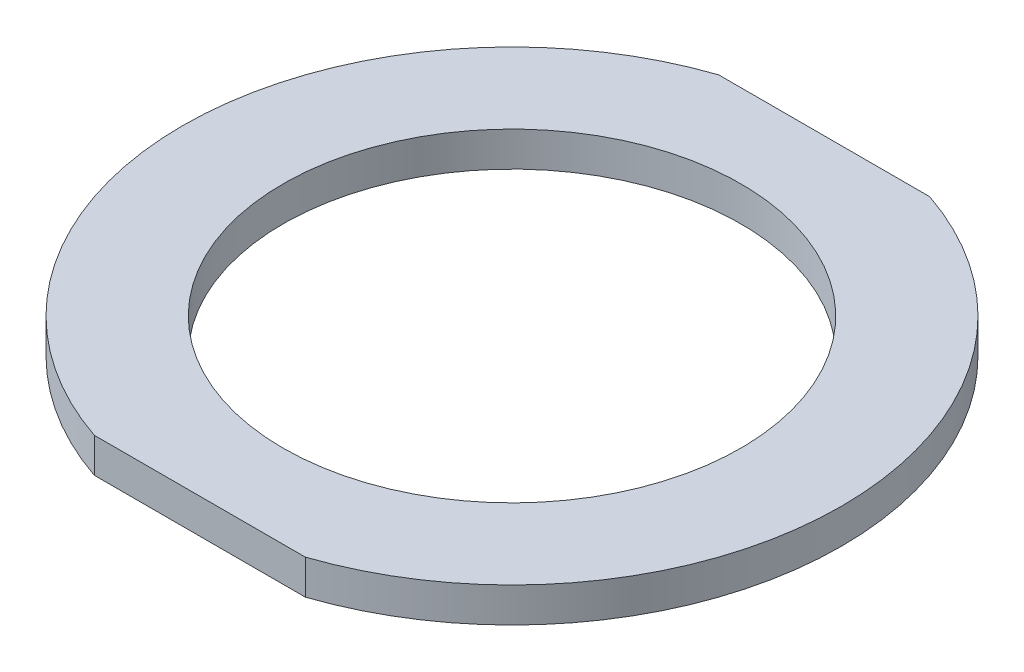
ISO-10303-21;
HEADER;
FILE_DESCRIPTION(('STEP AP214'),'2;1');
FILE_NAME('part.step','',(''),(''),'','','');
FILE_SCHEMA(('AUTOMOTIVE_DESIGN { 1 0 10303 214 1 1 1 1 }'));
ENDSEC;
DATA;
#1=APPLICATION_CONTEXT('core data for automotive mechanical design processes');
#2=APPLICATION_PROTOCOL_DEFINITION('international standard','automotive_design',2000,#1);
#3=PRODUCT_CONTEXT('',#1,'mechanical');
#4=PRODUCT('Part','Part','',(#3));
#5=PRODUCT_RELATED_PRODUCT_CATEGORY('part','',(#4));
#6=PRODUCT_DEFINITION_FORMATION('','',#4);
#7=PRODUCT_DEFINITION_CONTEXT('part definition',#1,'design');
#8=PRODUCT_DEFINITION('design','',#6,#7);
#9=PRODUCT_DEFINITION_SHAPE('','',#8);
#10=(LENGTH_UNIT() NAMED_UNIT(*) SI_UNIT(.MILLI.,.METRE.));
#11=(NAMED_UNIT(*) PLANE_ANGLE_UNIT() SI_UNIT($,.RADIAN.));
#12=(NAMED_UNIT(*) SI_UNIT($,.STERADIAN.) SOLID_ANGLE_UNIT());
#13=UNCERTAINTY_MEASURE_WITH_UNIT(LENGTH_MEASURE(1.E-05),#10,'distance_accuracy_value','');
#14=(GEOMETRIC_REPRESENTATION_CONTEXT(3) GLOBAL_UNCERTAINTY_ASSIGNED_CONTEXT((#13)) GLOBAL_UNIT_ASSIGNED_CONTEXT((#10,
#11,#12)) REPRESENTATION_CONTEXT('',''));
#15=CARTESIAN_POINT('',(0.,0.,0.));
#16=DIRECTION('',(0.,0.,1.));
#17=DIRECTION('',(1.,0.,0.));
#18=AXIS2_PLACEMENT_3D('',#15,#16,#17);
#19=CARTESIAN_POINT('',(0.,5.,0.));
#20=DIRECTION('',(0.,1.,0.));
#21=DIRECTION('',(0.,0.,1.));
#22=AXIS2_PLACEMENT_3D('',#19,#20,#21);
#23=PLANE('',#22);
#24=CARTESIAN_POINT('',(0.,5.,0.));
#25=DIRECTION('',(0.,1.,0.));
#26=DIRECTION('',(0.,0.,1.));
#27=AXIS2_PLACEMENT_3D('',#24,#25,#26);
#28=CIRCLE('',#27,33.);
#29=CARTESIAN_POINT('',(0.,5.,33.));
#30=VERTEX_POINT('',#29);
#31=EDGE_CURVE('E109',#30,#30,#28,.T.);
#32=ORIENTED_EDGE('',*,*,#31,.F.);
#33=EDGE_LOOP('',(#32));
#34=FACE_BOUND('',#33,.T.);
#35=CARTESIAN_POINT('',(0.,5.,0.));
#36=DIRECTION('',(0.,1.,0.));
#37=DIRECTION('',(0.,0.,1.));
#38=AXIS2_PLACEMENT_3D('',#35,#36,#37);
#39=CIRCLE('',#38,47.5);
#40=CARTESIAN_POINT('',(15.2069063257456,5.,45.));
#41=VERTEX_POINT('',#40);
#42=CARTESIAN_POINT('',(15.2069063257456,5.,-45.));
#43=VERTEX_POINT('',#42);
#44=EDGE_CURVE('E81',#41,#43,#39,.T.);
#45=ORIENTED_EDGE('',*,*,#44,.T.);
#46=DIRECTION('',(-1.,0.,0.));
#47=VECTOR('',#46,1.);
#48=CARTESIAN_POINT('',(0.,5.,-45.));
#49=LINE('',#48,#47);
#50=CARTESIAN_POINT('',(-15.2069063257456,5.,-45.));
#51=VERTEX_POINT('',#50);
#52=EDGE_CURVE('E74',#43,#51,#49,.T.);
#53=ORIENTED_EDGE('',*,*,#52,.T.);
#54=CARTESIAN_POINT('',(-15.2069063257456,5.,45.));
#55=VERTEX_POINT('',#54);
#56=EDGE_CURVE('E56',#51,#55,#39,.T.);
#57=ORIENTED_EDGE('',*,*,#56,.T.);
#58=DIRECTION('',(-1.,0.,0.));
#59=VECTOR('',#58,1.);
#60=CARTESIAN_POINT('',(0.,5.,45.));
#61=LINE('',#60,#59);
#62=EDGE_CURVE('E108',#41,#55,#61,.T.);
#63=ORIENTED_EDGE('',*,*,#62,.F.);
#64=EDGE_LOOP('',(#45,#53,#57,#63));
#65=FACE_BOUND('',#64,.T.);
#66=ADVANCED_FACE('F34',(#34,#65),#23,.T.);
#67=CARTESIAN_POINT('',(0.,0.,0.));
#68=DIRECTION('',(0.,1.,0.));
#69=DIRECTION('',(0.,0.,1.));
#70=AXIS2_PLACEMENT_3D('',#67,#68,#69);
#71=PLANE('',#70);
#72=CARTESIAN_POINT('',(0.,0.,0.));
#73=DIRECTION('',(0.,1.,0.));
#74=DIRECTION('',(0.,0.,1.));
#75=AXIS2_PLACEMENT_3D('',#72,#73,#74);
#76=CIRCLE('',#75,33.);
#77=CARTESIAN_POINT('',(0.,0.,33.));
#78=VERTEX_POINT('',#77);
#79=EDGE_CURVE('E94',#78,#78,#76,.T.);
#80=ORIENTED_EDGE('',*,*,#79,.T.);
#81=EDGE_LOOP('',(#80));
#82=FACE_BOUND('',#81,.T.);
#83=DIRECTION('',(-1.,0.,0.));
#84=VECTOR('',#83,1.);
#85=CARTESIAN_POINT('',(0.,0.,-45.));
#86=LINE('',#85,#84);
#87=CARTESIAN_POINT('',(15.2069063257456,0.,-45.));
#88=VERTEX_POINT('',#87);
#89=CARTESIAN_POINT('',(-15.2069063257456,0.,-45.));
#90=VERTEX_POINT('',#89);
#91=EDGE_CURVE('E48',#88,#90,#86,.T.);
#92=ORIENTED_EDGE('',*,*,#91,.F.);
#93=CARTESIAN_POINT('',(0.,0.,0.));
#94=DIRECTION('',(0.,1.,0.));
#95=DIRECTION('',(0.,0.,1.));
#96=AXIS2_PLACEMENT_3D('',#93,#94,#95);
#97=CIRCLE('',#96,47.5);
#98=CARTESIAN_POINT('',(15.2069063257456,0.,45.));
#99=VERTEX_POINT('',#98);
#100=EDGE_CURVE('E88',#99,#88,#97,.T.);
#101=ORIENTED_EDGE('',*,*,#100,.F.);
#102=DIRECTION('',(-1.,0.,0.));
#103=VECTOR('',#102,1.);
#104=CARTESIAN_POINT('',(0.,0.,45.));
#105=LINE('',#104,#103);
#106=CARTESIAN_POINT('',(-15.2069063257456,0.,45.));
#107=VERTEX_POINT('',#106);
#108=EDGE_CURVE('E82',#99,#107,#105,.T.);
#109=ORIENTED_EDGE('',*,*,#108,.T.);
#110=EDGE_CURVE('E91',#90,#107,#97,.T.);
#111=ORIENTED_EDGE('',*,*,#110,.F.);
#112=EDGE_LOOP('',(#92,#101,#109,#111));
#113=FACE_BOUND('',#112,.T.);
#114=ADVANCED_FACE('F104',(#82,#113),#71,.F.);
#115=CARTESIAN_POINT('',(0.,5.,0.));
#116=DIRECTION('',(0.,-1.,0.));
#117=DIRECTION('',(0.,0.,-1.));
#118=AXIS2_PLACEMENT_3D('',#115,#116,#117);
#119=CYLINDRICAL_SURFACE('',#118,47.5);
#120=DIRECTION('',(0.,-1.,0.));
#121=VECTOR('',#120,1.);
#122=CARTESIAN_POINT('',(15.2069063257456,5.,-45.));
#123=LINE('',#122,#121);
#124=EDGE_CURVE('E11',#43,#88,#123,.T.);
#125=ORIENTED_EDGE('',*,*,#124,.F.);
#126=ORIENTED_EDGE('',*,*,#44,.F.);
#127=DIRECTION('',(0.,-1.,0.));
#128=VECTOR('',#127,1.);
#129=CARTESIAN_POINT('',(15.2069063257456,5.,45.));
#130=LINE('',#129,#128);
#131=EDGE_CURVE('E78',#41,#99,#130,.T.);
#132=ORIENTED_EDGE('',*,*,#131,.T.);
#133=ORIENTED_EDGE('',*,*,#100,.T.);
#134=EDGE_LOOP('',(#125,#126,#132,#133));
#135=FACE_BOUND('',#134,.T.);
#136=ADVANCED_FACE('F36',(#135),#119,.T.);
#137=DIRECTION('',(0.,-1.,0.));
#138=VECTOR('',#137,1.);
#139=CARTESIAN_POINT('',(-15.2069063257456,5.,-45.));
#140=LINE('',#139,#138);
#141=EDGE_CURVE('E42',#90,#51,#140,.F.);
#142=ORIENTED_EDGE('',*,*,#141,.F.);
#143=ORIENTED_EDGE('',*,*,#110,.T.);
#144=DIRECTION('',(0.,-1.,0.));
#145=VECTOR('',#144,1.);
#146=CARTESIAN_POINT('',(-15.2069063257456,5.,45.));
#147=LINE('',#146,#145);
#148=EDGE_CURVE('E87',#107,#55,#147,.F.);
#149=ORIENTED_EDGE('',*,*,#148,.T.);
#150=ORIENTED_EDGE('',*,*,#56,.F.);
#151=EDGE_LOOP('',(#142,#143,#149,#150));
#152=FACE_BOUND('',#151,.T.);
#153=ADVANCED_FACE('F85',(#152),#119,.T.);
#154=CARTESIAN_POINT('',(0.,5.,0.));
#155=DIRECTION('',(0.,-1.,0.));
#156=DIRECTION('',(0.,0.,-1.));
#157=AXIS2_PLACEMENT_3D('',#154,#155,#156);
#158=CYLINDRICAL_SURFACE('',#157,33.);
#159=ORIENTED_EDGE('',*,*,#31,.T.);
#160=EDGE_LOOP('',(#159));
#161=FACE_BOUND('',#160,.T.);
#162=ORIENTED_EDGE('',*,*,#79,.F.);
#163=EDGE_LOOP('',(#162));
#164=FACE_BOUND('',#163,.T.);
#165=ADVANCED_FACE('F117',(#161,#164),#158,.F.);
#166=CARTESIAN_POINT('',(-25.,0.,45.));
#167=DIRECTION('',(0.,0.,-1.));
#168=DIRECTION('',(-1.,0.,0.));
#169=AXIS2_PLACEMENT_3D('',#166,#167,#168);
#170=PLANE('',#169);
#171=ORIENTED_EDGE('',*,*,#62,.T.);
#172=ORIENTED_EDGE('',*,*,#148,.F.);
#173=ORIENTED_EDGE('',*,*,#108,.F.);
#174=ORIENTED_EDGE('',*,*,#131,.F.);
#175=EDGE_LOOP('',(#171,#172,#173,#174));
#176=FACE_BOUND('',#175,.T.);
#177=ADVANCED_FACE('F119',(#176),#170,.F.);
#178=CARTESIAN_POINT('',(-25.,0.,-45.));
#179=DIRECTION('',(0.,0.,-1.));
#180=DIRECTION('',(-1.,0.,0.));
#181=AXIS2_PLACEMENT_3D('',#178,#179,#180);
#182=PLANE('',#181);
#183=ORIENTED_EDGE('',*,*,#124,.T.);
#184=ORIENTED_EDGE('',*,*,#91,.T.);
#185=ORIENTED_EDGE('',*,*,#141,.T.);
#186=ORIENTED_EDGE('',*,*,#52,.F.);
#187=EDGE_LOOP('',(#183,#184,#185,#186));
#188=FACE_BOUND('',#187,.T.);
#189=ADVANCED_FACE('F73',(#188),#182,.T.);
#190=CLOSED_SHELL('',(#66,#114,#136,#153,#165,#177,#189));
#191=MANIFOLD_SOLID_BREP('B2',#190);
#192=ADVANCED_BREP_SHAPE_REPRESENTATION('',(#18,#191),#14);
#193=SHAPE_DEFINITION_REPRESENTATION(#9,#192);
ENDSEC;
END-ISO-10303-21;
